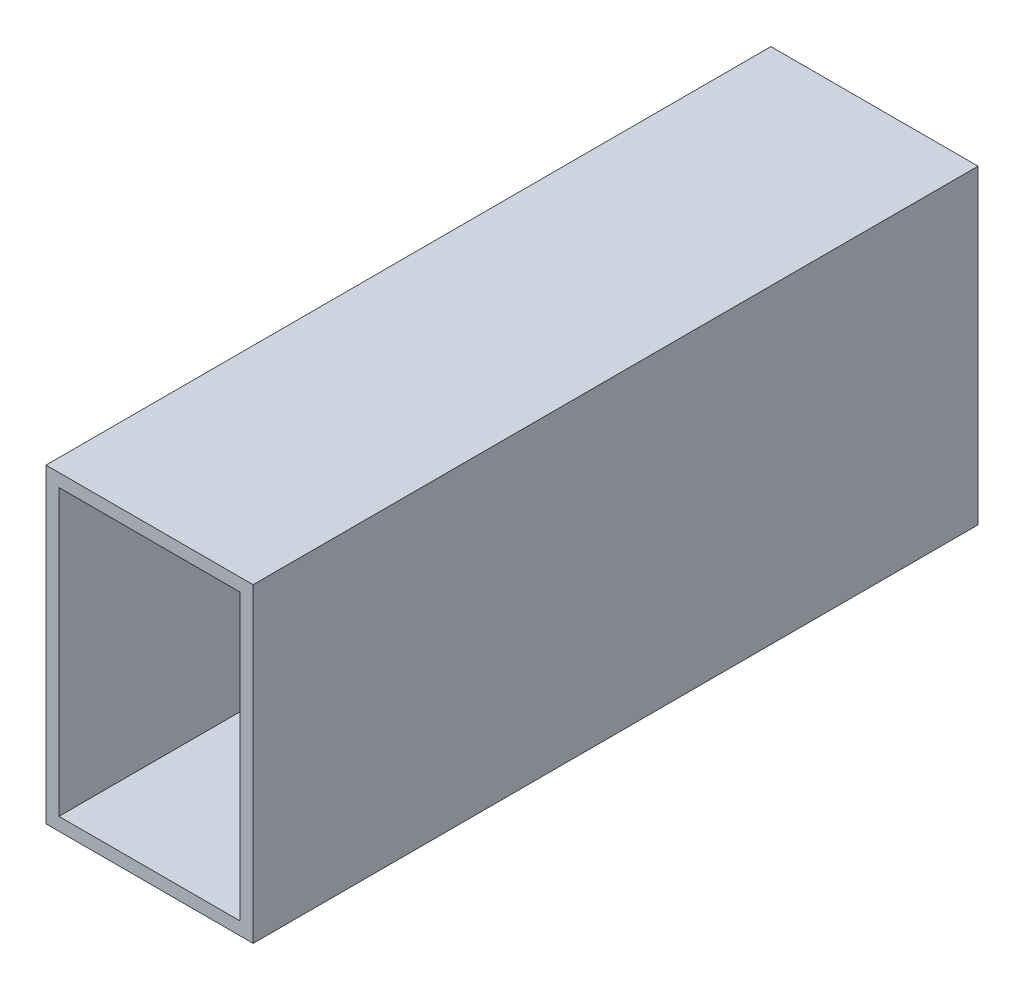
ISO-10303-21;
HEADER;
FILE_DESCRIPTION(('STEP AP214'),'2;1');
FILE_NAME('part.step','',(''),(''),'','','');
FILE_SCHEMA(('AUTOMOTIVE_DESIGN { 1 0 10303 214 1 1 1 1 }'));
ENDSEC;
DATA;
#1=APPLICATION_CONTEXT('core data for automotive mechanical design processes');
#2=APPLICATION_PROTOCOL_DEFINITION('international standard','automotive_design',2000,#1);
#3=PRODUCT_CONTEXT('',#1,'mechanical');
#4=PRODUCT('Part','Part','',(#3));
#5=PRODUCT_RELATED_PRODUCT_CATEGORY('part','',(#4));
#6=PRODUCT_DEFINITION_FORMATION('','',#4);
#7=PRODUCT_DEFINITION_CONTEXT('part definition',#1,'design');
#8=PRODUCT_DEFINITION('design','',#6,#7);
#9=PRODUCT_DEFINITION_SHAPE('','',#8);
#10=(LENGTH_UNIT() NAMED_UNIT(*) SI_UNIT(.MILLI.,.METRE.));
#11=(NAMED_UNIT(*) PLANE_ANGLE_UNIT() SI_UNIT($,.RADIAN.));
#12=(NAMED_UNIT(*) SI_UNIT($,.STERADIAN.) SOLID_ANGLE_UNIT());
#13=UNCERTAINTY_MEASURE_WITH_UNIT(LENGTH_MEASURE(1.E-05),#10,'distance_accuracy_value','');
#14=(GEOMETRIC_REPRESENTATION_CONTEXT(3) GLOBAL_UNCERTAINTY_ASSIGNED_CONTEXT((#13)) GLOBAL_UNIT_ASSIGNED_CONTEXT((#10,
#11,#12)) REPRESENTATION_CONTEXT('',''));
#15=CARTESIAN_POINT('',(0.,0.,0.));
#16=DIRECTION('',(0.,0.,1.));
#17=DIRECTION('',(1.,0.,0.));
#18=AXIS2_PLACEMENT_3D('',#15,#16,#17);
#19=CARTESIAN_POINT('',(0.,0.,177.8));
#20=DIRECTION('',(0.,0.,1.));
#21=DIRECTION('',(1.,0.,0.));
#22=AXIS2_PLACEMENT_3D('',#19,#20,#21);
#23=PLANE('',#22);
#24=DIRECTION('',(0.,1.,0.));
#25=VECTOR('',#24,1.);
#26=CARTESIAN_POINT('',(25.4,38.1,177.8));
#27=LINE('',#26,#25);
#28=CARTESIAN_POINT('',(25.4,-38.1,177.8));
#29=VERTEX_POINT('',#28);
#30=CARTESIAN_POINT('',(25.4,38.1,177.8));
#31=VERTEX_POINT('',#30);
#32=EDGE_CURVE('E153',#29,#31,#27,.T.);
#33=ORIENTED_EDGE('',*,*,#32,.T.);
#34=DIRECTION('',(-1.,0.,0.));
#35=VECTOR('',#34,1.);
#36=CARTESIAN_POINT('',(-25.4,38.1,177.8));
#37=LINE('',#36,#35);
#38=CARTESIAN_POINT('',(-25.4,38.1,177.8));
#39=VERTEX_POINT('',#38);
#40=EDGE_CURVE('E157',#31,#39,#37,.T.);
#41=ORIENTED_EDGE('',*,*,#40,.T.);
#42=DIRECTION('',(0.,-1.,0.));
#43=VECTOR('',#42,1.);
#44=CARTESIAN_POINT('',(-25.4,38.1,177.8));
#45=LINE('',#44,#43);
#46=CARTESIAN_POINT('',(-25.3999999999999,-38.1,177.8));
#47=VERTEX_POINT('',#46);
#48=EDGE_CURVE('E161',#39,#47,#45,.T.);
#49=ORIENTED_EDGE('',*,*,#48,.T.);
#50=DIRECTION('',(1.,0.,0.));
#51=VECTOR('',#50,1.);
#52=CARTESIAN_POINT('',(-25.3999999999999,-38.1,177.8));
#53=LINE('',#52,#51);
#54=EDGE_CURVE('E164',#47,#29,#53,.T.);
#55=ORIENTED_EDGE('',*,*,#54,.T.);
#56=EDGE_LOOP('',(#33,#41,#49,#55));
#57=FACE_BOUND('',#56,.T.);
#58=DIRECTION('',(1.,0.,0.));
#59=VECTOR('',#58,1.);
#60=CARTESIAN_POINT('',(-22.225,-34.925,177.8));
#61=LINE('',#60,#59);
#62=CARTESIAN_POINT('',(-22.225,-34.925,177.8));
#63=VERTEX_POINT('',#62);
#64=CARTESIAN_POINT('',(22.225,-34.925,177.8));
#65=VERTEX_POINT('',#64);
#66=EDGE_CURVE('E114',#63,#65,#61,.T.);
#67=ORIENTED_EDGE('',*,*,#66,.F.);
#68=DIRECTION('',(0.,-1.,0.));
#69=VECTOR('',#68,1.);
#70=CARTESIAN_POINT('',(-22.225,34.925,177.8));
#71=LINE('',#70,#69);
#72=CARTESIAN_POINT('',(-22.225,34.925,177.8));
#73=VERTEX_POINT('',#72);
#74=EDGE_CURVE('E105',#73,#63,#71,.T.);
#75=ORIENTED_EDGE('',*,*,#74,.F.);
#76=DIRECTION('',(-1.,0.,0.));
#77=VECTOR('',#76,1.);
#78=CARTESIAN_POINT('',(-22.225,34.925,177.8));
#79=LINE('',#78,#77);
#80=CARTESIAN_POINT('',(22.225,34.925,177.8));
#81=VERTEX_POINT('',#80);
#82=EDGE_CURVE('E131',#81,#73,#79,.T.);
#83=ORIENTED_EDGE('',*,*,#82,.F.);
#84=DIRECTION('',(0.,1.,0.));
#85=VECTOR('',#84,1.);
#86=CARTESIAN_POINT('',(22.225,34.925,177.8));
#87=LINE('',#86,#85);
#88=EDGE_CURVE('E127',#65,#81,#87,.T.);
#89=ORIENTED_EDGE('',*,*,#88,.F.);
#90=EDGE_LOOP('',(#67,#75,#83,#89));
#91=FACE_BOUND('',#90,.T.);
#92=ADVANCED_FACE('F39',(#57,#91),#23,.T.);
#93=CARTESIAN_POINT('',(0.,0.,0.));
#94=DIRECTION('',(0.,0.,1.));
#95=DIRECTION('',(1.,0.,0.));
#96=AXIS2_PLACEMENT_3D('',#93,#94,#95);
#97=PLANE('',#96);
#98=DIRECTION('',(0.,1.,0.));
#99=VECTOR('',#98,1.);
#100=CARTESIAN_POINT('',(25.4,38.1,0.));
#101=LINE('',#100,#99);
#102=CARTESIAN_POINT('',(25.4,-38.1,0.));
#103=VERTEX_POINT('',#102);
#104=CARTESIAN_POINT('',(25.4,38.1,0.));
#105=VERTEX_POINT('',#104);
#106=EDGE_CURVE('E123',#103,#105,#101,.T.);
#107=ORIENTED_EDGE('',*,*,#106,.F.);
#108=DIRECTION('',(1.,0.,0.));
#109=VECTOR('',#108,1.);
#110=CARTESIAN_POINT('',(-25.3999999999999,-38.1,0.));
#111=LINE('',#110,#109);
#112=CARTESIAN_POINT('',(-25.3999999999999,-38.1,0.));
#113=VERTEX_POINT('',#112);
#114=EDGE_CURVE('E158',#113,#103,#111,.T.);
#115=ORIENTED_EDGE('',*,*,#114,.F.);
#116=DIRECTION('',(0.,-1.,0.));
#117=VECTOR('',#116,1.);
#118=CARTESIAN_POINT('',(-25.4,38.1,0.));
#119=LINE('',#118,#117);
#120=CARTESIAN_POINT('',(-25.4,38.1,0.));
#121=VERTEX_POINT('',#120);
#122=EDGE_CURVE('E174',#121,#113,#119,.T.);
#123=ORIENTED_EDGE('',*,*,#122,.F.);
#124=DIRECTION('',(-1.,0.,0.));
#125=VECTOR('',#124,1.);
#126=CARTESIAN_POINT('',(-25.4,38.1,0.));
#127=LINE('',#126,#125);
#128=EDGE_CURVE('E171',#105,#121,#127,.T.);
#129=ORIENTED_EDGE('',*,*,#128,.F.);
#130=EDGE_LOOP('',(#107,#115,#123,#129));
#131=FACE_BOUND('',#130,.T.);
#132=DIRECTION('',(0.,-1.,0.));
#133=VECTOR('',#132,1.);
#134=CARTESIAN_POINT('',(-22.225,34.925,0.));
#135=LINE('',#134,#133);
#136=CARTESIAN_POINT('',(-22.225,34.925,0.));
#137=VERTEX_POINT('',#136);
#138=CARTESIAN_POINT('',(-22.225,-34.925,0.));
#139=VERTEX_POINT('',#138);
#140=EDGE_CURVE('E63',#137,#139,#135,.T.);
#141=ORIENTED_EDGE('',*,*,#140,.T.);
#142=DIRECTION('',(1.,0.,0.));
#143=VECTOR('',#142,1.);
#144=CARTESIAN_POINT('',(-22.225,-34.925,0.));
#145=LINE('',#144,#143);
#146=CARTESIAN_POINT('',(22.225,-34.925,0.));
#147=VERTEX_POINT('',#146);
#148=EDGE_CURVE('E121',#139,#147,#145,.T.);
#149=ORIENTED_EDGE('',*,*,#148,.T.);
#150=DIRECTION('',(0.,1.,0.));
#151=VECTOR('',#150,1.);
#152=CARTESIAN_POINT('',(22.225,34.925,0.));
#153=LINE('',#152,#151);
#154=CARTESIAN_POINT('',(22.225,34.925,0.));
#155=VERTEX_POINT('',#154);
#156=EDGE_CURVE('E140',#147,#155,#153,.T.);
#157=ORIENTED_EDGE('',*,*,#156,.T.);
#158=DIRECTION('',(-1.,0.,0.));
#159=VECTOR('',#158,1.);
#160=CARTESIAN_POINT('',(-22.225,34.925,0.));
#161=LINE('',#160,#159);
#162=EDGE_CURVE('E115',#155,#137,#161,.T.);
#163=ORIENTED_EDGE('',*,*,#162,.T.);
#164=EDGE_LOOP('',(#141,#149,#157,#163));
#165=FACE_BOUND('',#164,.T.);
#166=ADVANCED_FACE('F197',(#131,#165),#97,.F.);
#167=CARTESIAN_POINT('',(25.4,38.1,177.8));
#168=DIRECTION('',(-1.,0.,0.));
#169=DIRECTION('',(0.,-1.,0.));
#170=AXIS2_PLACEMENT_3D('',#167,#168,#169);
#171=PLANE('',#170);
#172=ORIENTED_EDGE('',*,*,#106,.T.);
#173=DIRECTION('',(0.,0.,-1.));
#174=VECTOR('',#173,1.);
#175=CARTESIAN_POINT('',(25.4,38.1,177.8));
#176=LINE('',#175,#174);
#177=EDGE_CURVE('E11',#31,#105,#176,.T.);
#178=ORIENTED_EDGE('',*,*,#177,.F.);
#179=ORIENTED_EDGE('',*,*,#32,.F.);
#180=DIRECTION('',(0.,0.,-1.));
#181=VECTOR('',#180,1.);
#182=CARTESIAN_POINT('',(25.4,-38.1,177.8));
#183=LINE('',#182,#181);
#184=EDGE_CURVE('E167',#29,#103,#183,.T.);
#185=ORIENTED_EDGE('',*,*,#184,.T.);
#186=EDGE_LOOP('',(#172,#178,#179,#185));
#187=FACE_BOUND('',#186,.T.);
#188=ADVANCED_FACE('F41',(#187),#171,.F.);
#189=CARTESIAN_POINT('',(-25.4,38.1,177.8));
#190=DIRECTION('',(0.,-1.,0.));
#191=DIRECTION('',(0.,0.,-1.));
#192=AXIS2_PLACEMENT_3D('',#189,#190,#191);
#193=PLANE('',#192);
#194=ORIENTED_EDGE('',*,*,#128,.T.);
#195=DIRECTION('',(0.,0.,-1.));
#196=VECTOR('',#195,1.);
#197=CARTESIAN_POINT('',(-25.4,38.1,177.8));
#198=LINE('',#197,#196);
#199=EDGE_CURVE('E48',#39,#121,#198,.T.);
#200=ORIENTED_EDGE('',*,*,#199,.F.);
#201=ORIENTED_EDGE('',*,*,#40,.F.);
#202=ORIENTED_EDGE('',*,*,#177,.T.);
#203=EDGE_LOOP('',(#194,#200,#201,#202));
#204=FACE_BOUND('',#203,.T.);
#205=ADVANCED_FACE('F207',(#204),#193,.F.);
#206=CARTESIAN_POINT('',(-25.4,38.1,177.8));
#207=DIRECTION('',(1.,0.,0.));
#208=DIRECTION('',(0.,1.,0.));
#209=AXIS2_PLACEMENT_3D('',#206,#207,#208);
#210=PLANE('',#209);
#211=ORIENTED_EDGE('',*,*,#122,.T.);
#212=DIRECTION('',(0.,0.,-1.));
#213=VECTOR('',#212,1.);
#214=CARTESIAN_POINT('',(-25.3999999999999,-38.1,177.8));
#215=LINE('',#214,#213);
#216=EDGE_CURVE('E182',#47,#113,#215,.T.);
#217=ORIENTED_EDGE('',*,*,#216,.F.);
#218=ORIENTED_EDGE('',*,*,#48,.F.);
#219=ORIENTED_EDGE('',*,*,#199,.T.);
#220=EDGE_LOOP('',(#211,#217,#218,#219));
#221=FACE_BOUND('',#220,.T.);
#222=ADVANCED_FACE('F191',(#221),#210,.F.);
#223=CARTESIAN_POINT('',(-25.3999999999999,-38.1,177.8));
#224=DIRECTION('',(0.,1.,0.));
#225=DIRECTION('',(0.,0.,1.));
#226=AXIS2_PLACEMENT_3D('',#223,#224,#225);
#227=PLANE('',#226);
#228=ORIENTED_EDGE('',*,*,#114,.T.);
#229=ORIENTED_EDGE('',*,*,#184,.F.);
#230=ORIENTED_EDGE('',*,*,#54,.F.);
#231=ORIENTED_EDGE('',*,*,#216,.T.);
#232=EDGE_LOOP('',(#228,#229,#230,#231));
#233=FACE_BOUND('',#232,.T.);
#234=ADVANCED_FACE('F201',(#233),#227,.F.);
#235=CARTESIAN_POINT('',(-22.225,34.925,177.8));
#236=DIRECTION('',(1.,0.,0.));
#237=DIRECTION('',(0.,1.,0.));
#238=AXIS2_PLACEMENT_3D('',#235,#236,#237);
#239=PLANE('',#238);
#240=ORIENTED_EDGE('',*,*,#140,.F.);
#241=DIRECTION('',(0.,0.,-1.));
#242=VECTOR('',#241,1.);
#243=CARTESIAN_POINT('',(-22.225,34.925,177.8));
#244=LINE('',#243,#242);
#245=EDGE_CURVE('E109',#73,#137,#244,.T.);
#246=ORIENTED_EDGE('',*,*,#245,.F.);
#247=ORIENTED_EDGE('',*,*,#74,.T.);
#248=DIRECTION('',(0.,0.,-1.));
#249=VECTOR('',#248,1.);
#250=CARTESIAN_POINT('',(-22.225,-34.925,177.8));
#251=LINE('',#250,#249);
#252=EDGE_CURVE('E108',#63,#139,#251,.T.);
#253=ORIENTED_EDGE('',*,*,#252,.T.);
#254=EDGE_LOOP('',(#240,#246,#247,#253));
#255=FACE_BOUND('',#254,.T.);
#256=ADVANCED_FACE('F107',(#255),#239,.T.);
#257=CARTESIAN_POINT('',(-22.225,-34.925,177.8));
#258=DIRECTION('',(0.,1.,0.));
#259=DIRECTION('',(-1.,0.,0.));
#260=AXIS2_PLACEMENT_3D('',#257,#258,#259);
#261=PLANE('',#260);
#262=ORIENTED_EDGE('',*,*,#148,.F.);
#263=ORIENTED_EDGE('',*,*,#252,.F.);
#264=ORIENTED_EDGE('',*,*,#66,.T.);
#265=DIRECTION('',(0.,0.,-1.));
#266=VECTOR('',#265,1.);
#267=CARTESIAN_POINT('',(22.225,-34.925,177.8));
#268=LINE('',#267,#266);
#269=EDGE_CURVE('E124',#65,#147,#268,.T.);
#270=ORIENTED_EDGE('',*,*,#269,.T.);
#271=EDGE_LOOP('',(#262,#263,#264,#270));
#272=FACE_BOUND('',#271,.T.);
#273=ADVANCED_FACE('F118',(#272),#261,.T.);
#274=CARTESIAN_POINT('',(22.225,34.925,177.8));
#275=DIRECTION('',(-1.,0.,0.));
#276=DIRECTION('',(0.,-1.,0.));
#277=AXIS2_PLACEMENT_3D('',#274,#275,#276);
#278=PLANE('',#277);
#279=ORIENTED_EDGE('',*,*,#156,.F.);
#280=ORIENTED_EDGE('',*,*,#269,.F.);
#281=ORIENTED_EDGE('',*,*,#88,.T.);
#282=DIRECTION('',(0.,0.,-1.));
#283=VECTOR('',#282,1.);
#284=CARTESIAN_POINT('',(22.225,34.925,177.8));
#285=LINE('',#284,#283);
#286=EDGE_CURVE('E55',#81,#155,#285,.T.);
#287=ORIENTED_EDGE('',*,*,#286,.T.);
#288=EDGE_LOOP('',(#279,#280,#281,#287));
#289=FACE_BOUND('',#288,.T.);
#290=ADVANCED_FACE('F230',(#289),#278,.T.);
#291=CARTESIAN_POINT('',(-22.225,34.925,177.8));
#292=DIRECTION('',(0.,-1.,0.));
#293=DIRECTION('',(1.,0.,0.));
#294=AXIS2_PLACEMENT_3D('',#291,#292,#293);
#295=PLANE('',#294);
#296=ORIENTED_EDGE('',*,*,#162,.F.);
#297=ORIENTED_EDGE('',*,*,#286,.F.);
#298=ORIENTED_EDGE('',*,*,#82,.T.);
#299=ORIENTED_EDGE('',*,*,#245,.T.);
#300=EDGE_LOOP('',(#296,#297,#298,#299));
#301=FACE_BOUND('',#300,.T.);
#302=ADVANCED_FACE('F234',(#301),#295,.T.);
#303=CLOSED_SHELL('',(#92,#166,#188,#205,#222,#234,#256,#273,#290,#302));
#304=MANIFOLD_SOLID_BREP('B2',#303);
#305=ADVANCED_BREP_SHAPE_REPRESENTATION('',(#18,#304),#14);
#306=SHAPE_DEFINITION_REPRESENTATION(#9,#305);
ENDSEC;
END-ISO-10303-21;
